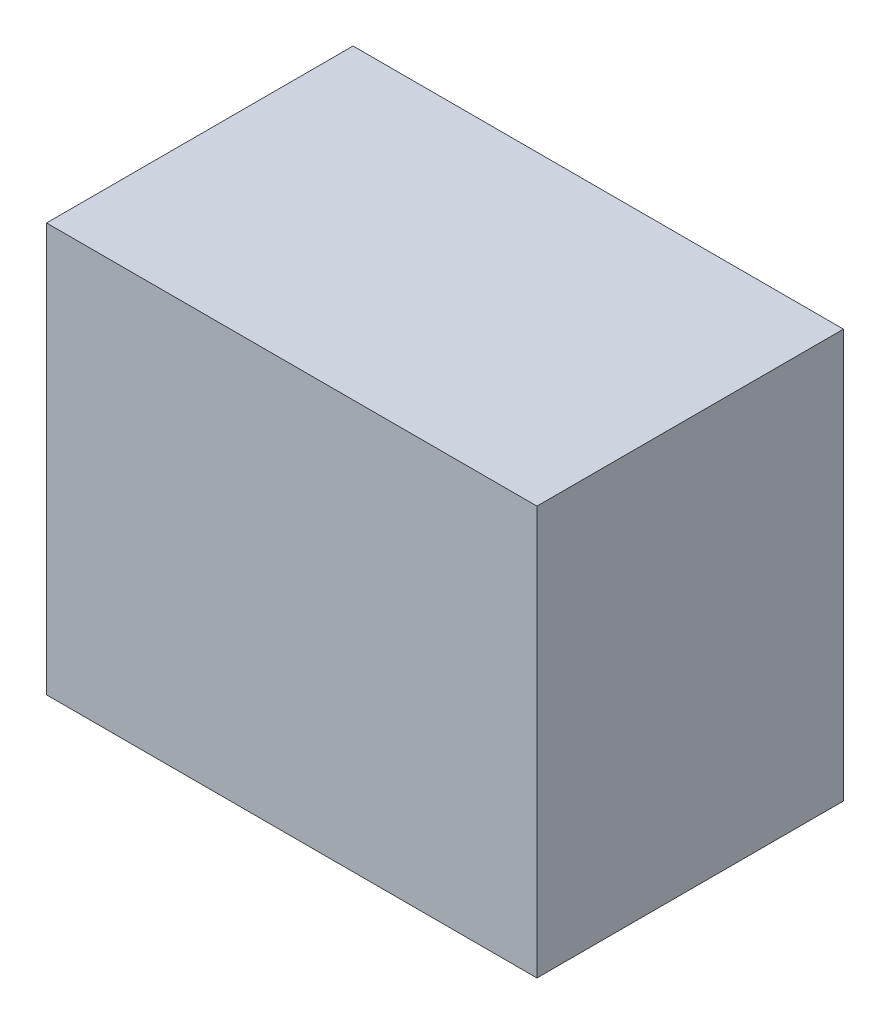
ISO-10303-21;
HEADER;
FILE_DESCRIPTION(('STEP AP214'),'2;1');
FILE_NAME('part.step','',(''),(''),'','','');
FILE_SCHEMA(('AUTOMOTIVE_DESIGN { 1 0 10303 214 1 1 1 1 }'));
ENDSEC;
DATA;
#1=APPLICATION_CONTEXT('core data for automotive mechanical design processes');
#2=APPLICATION_PROTOCOL_DEFINITION('international standard','automotive_design',2000,#1);
#3=PRODUCT_CONTEXT('',#1,'mechanical');
#4=PRODUCT('Part','Part','',(#3));
#5=PRODUCT_RELATED_PRODUCT_CATEGORY('part','',(#4));
#6=PRODUCT_DEFINITION_FORMATION('','',#4);
#7=PRODUCT_DEFINITION_CONTEXT('part definition',#1,'design');
#8=PRODUCT_DEFINITION('design','',#6,#7);
#9=PRODUCT_DEFINITION_SHAPE('','',#8);
#10=(LENGTH_UNIT() NAMED_UNIT(*) SI_UNIT(.MILLI.,.METRE.));
#11=(NAMED_UNIT(*) PLANE_ANGLE_UNIT() SI_UNIT($,.RADIAN.));
#12=(NAMED_UNIT(*) SI_UNIT($,.STERADIAN.) SOLID_ANGLE_UNIT());
#13=UNCERTAINTY_MEASURE_WITH_UNIT(LENGTH_MEASURE(1.E-05),#10,'distance_accuracy_value','');
#14=(GEOMETRIC_REPRESENTATION_CONTEXT(3) GLOBAL_UNCERTAINTY_ASSIGNED_CONTEXT((#13)) GLOBAL_UNIT_ASSIGNED_CONTEXT((#10,
#11,#12)) REPRESENTATION_CONTEXT('',''));
#15=CARTESIAN_POINT('',(0.,0.,0.));
#16=DIRECTION('',(0.,0.,1.));
#17=DIRECTION('',(1.,0.,0.));
#18=AXIS2_PLACEMENT_3D('',#15,#16,#17);
#19=CARTESIAN_POINT('',(60.,180.,-248.));
#20=DIRECTION('',(-1.,0.,0.));
#21=DIRECTION('',(0.,0.,1.));
#22=AXIS2_PLACEMENT_3D('',#19,#20,#21);
#23=PLANE('',#22);
#24=DIRECTION('',(0.,-1.,0.));
#25=VECTOR('',#24,1.);
#26=CARTESIAN_POINT('',(60.,180.,-173.));
#27=LINE('',#26,#25);
#28=CARTESIAN_POINT('',(60.,280.,-173.));
#29=VERTEX_POINT('',#28);
#30=CARTESIAN_POINT('',(60.,180.,-173.));
#31=VERTEX_POINT('',#30);
#32=EDGE_CURVE('E103',#29,#31,#27,.T.);
#33=ORIENTED_EDGE('',*,*,#32,.F.);
#34=DIRECTION('',(0.,0.,1.));
#35=VECTOR('',#34,1.);
#36=CARTESIAN_POINT('',(60.,280.,-248.));
#37=LINE('',#36,#35);
#38=CARTESIAN_POINT('',(60.,280.,-248.));
#39=VERTEX_POINT('',#38);
#40=EDGE_CURVE('E11',#39,#29,#37,.T.);
#41=ORIENTED_EDGE('',*,*,#40,.F.);
#42=DIRECTION('',(0.,-1.,0.));
#43=VECTOR('',#42,1.);
#44=CARTESIAN_POINT('',(60.,180.,-248.));
#45=LINE('',#44,#43);
#46=CARTESIAN_POINT('',(60.,180.,-248.));
#47=VERTEX_POINT('',#46);
#48=EDGE_CURVE('E97',#39,#47,#45,.T.);
#49=ORIENTED_EDGE('',*,*,#48,.T.);
#50=DIRECTION('',(0.,0.,1.));
#51=VECTOR('',#50,1.);
#52=CARTESIAN_POINT('',(60.,180.,-248.));
#53=LINE('',#52,#51);
#54=EDGE_CURVE('E42',#47,#31,#53,.T.);
#55=ORIENTED_EDGE('',*,*,#54,.T.);
#56=EDGE_LOOP('',(#33,#41,#49,#55));
#57=FACE_BOUND('',#56,.T.);
#58=ADVANCED_FACE('F39',(#57),#23,.T.);
#59=CARTESIAN_POINT('',(60.,280.,-248.));
#60=DIRECTION('',(0.,1.,0.));
#61=DIRECTION('',(0.,0.,1.));
#62=AXIS2_PLACEMENT_3D('',#59,#60,#61);
#63=PLANE('',#62);
#64=DIRECTION('',(-1.,0.,0.));
#65=VECTOR('',#64,1.);
#66=CARTESIAN_POINT('',(60.,280.,-173.));
#67=LINE('',#66,#65);
#68=CARTESIAN_POINT('',(180.,280.,-173.));
#69=VERTEX_POINT('',#68);
#70=EDGE_CURVE('E99',#69,#29,#67,.T.);
#71=ORIENTED_EDGE('',*,*,#70,.F.);
#72=DIRECTION('',(0.,0.,1.));
#73=VECTOR('',#72,1.);
#74=CARTESIAN_POINT('',(180.,280.,-248.));
#75=LINE('',#74,#73);
#76=CARTESIAN_POINT('',(180.,280.,-248.));
#77=VERTEX_POINT('',#76);
#78=EDGE_CURVE('E48',#77,#69,#75,.T.);
#79=ORIENTED_EDGE('',*,*,#78,.F.);
#80=DIRECTION('',(-1.,0.,0.));
#81=VECTOR('',#80,1.);
#82=CARTESIAN_POINT('',(60.,280.,-248.));
#83=LINE('',#82,#81);
#84=EDGE_CURVE('E94',#77,#39,#83,.T.);
#85=ORIENTED_EDGE('',*,*,#84,.T.);
#86=ORIENTED_EDGE('',*,*,#40,.T.);
#87=EDGE_LOOP('',(#71,#79,#85,#86));
#88=FACE_BOUND('',#87,.T.);
#89=ADVANCED_FACE('F113',(#88),#63,.T.);
#90=CARTESIAN_POINT('',(180.,180.,-248.));
#91=DIRECTION('',(1.,0.,0.));
#92=DIRECTION('',(0.,0.,-1.));
#93=AXIS2_PLACEMENT_3D('',#90,#91,#92);
#94=PLANE('',#93);
#95=DIRECTION('',(0.,1.,0.));
#96=VECTOR('',#95,1.);
#97=CARTESIAN_POINT('',(180.,180.,-173.));
#98=LINE('',#97,#96);
#99=CARTESIAN_POINT('',(180.,180.,-173.));
#100=VERTEX_POINT('',#99);
#101=EDGE_CURVE('E89',#100,#69,#98,.T.);
#102=ORIENTED_EDGE('',*,*,#101,.F.);
#103=DIRECTION('',(0.,0.,1.));
#104=VECTOR('',#103,1.);
#105=CARTESIAN_POINT('',(180.,180.,-248.));
#106=LINE('',#105,#104);
#107=CARTESIAN_POINT('',(180.,180.,-248.));
#108=VERTEX_POINT('',#107);
#109=EDGE_CURVE('E84',#108,#100,#106,.T.);
#110=ORIENTED_EDGE('',*,*,#109,.F.);
#111=DIRECTION('',(0.,1.,0.));
#112=VECTOR('',#111,1.);
#113=CARTESIAN_POINT('',(180.,180.,-248.));
#114=LINE('',#113,#112);
#115=EDGE_CURVE('E87',#108,#77,#114,.T.);
#116=ORIENTED_EDGE('',*,*,#115,.T.);
#117=ORIENTED_EDGE('',*,*,#78,.T.);
#118=EDGE_LOOP('',(#102,#110,#116,#117));
#119=FACE_BOUND('',#118,.T.);
#120=ADVANCED_FACE('F86',(#119),#94,.T.);
#121=CARTESIAN_POINT('',(60.,180.,-248.));
#122=DIRECTION('',(0.,-1.,0.));
#123=DIRECTION('',(0.,0.,-1.));
#124=AXIS2_PLACEMENT_3D('',#121,#122,#123);
#125=PLANE('',#124);
#126=DIRECTION('',(1.,0.,0.));
#127=VECTOR('',#126,1.);
#128=CARTESIAN_POINT('',(60.,180.,-173.));
#129=LINE('',#128,#127);
#130=EDGE_CURVE('E106',#31,#100,#129,.T.);
#131=ORIENTED_EDGE('',*,*,#130,.F.);
#132=ORIENTED_EDGE('',*,*,#54,.F.);
#133=DIRECTION('',(1.,0.,0.));
#134=VECTOR('',#133,1.);
#135=CARTESIAN_POINT('',(60.,180.,-248.));
#136=LINE('',#135,#134);
#137=EDGE_CURVE('E93',#47,#108,#136,.T.);
#138=ORIENTED_EDGE('',*,*,#137,.T.);
#139=ORIENTED_EDGE('',*,*,#109,.T.);
#140=EDGE_LOOP('',(#131,#132,#138,#139));
#141=FACE_BOUND('',#140,.T.);
#142=ADVANCED_FACE('F96',(#141),#125,.T.);
#143=CARTESIAN_POINT('',(0.,0.,-248.));
#144=DIRECTION('',(0.,0.,-1.));
#145=DIRECTION('',(-1.,0.,0.));
#146=AXIS2_PLACEMENT_3D('',#143,#144,#145);
#147=PLANE('',#146);
#148=ORIENTED_EDGE('',*,*,#48,.F.);
#149=ORIENTED_EDGE('',*,*,#84,.F.);
#150=ORIENTED_EDGE('',*,*,#115,.F.);
#151=ORIENTED_EDGE('',*,*,#137,.F.);
#152=EDGE_LOOP('',(#148,#149,#150,#151));
#153=FACE_BOUND('',#152,.T.);
#154=ADVANCED_FACE('F92',(#153),#147,.T.);
#155=CARTESIAN_POINT('',(0.,0.,-173.));
#156=DIRECTION('',(0.,0.,-1.));
#157=DIRECTION('',(-1.,0.,0.));
#158=AXIS2_PLACEMENT_3D('',#155,#156,#157);
#159=PLANE('',#158);
#160=ORIENTED_EDGE('',*,*,#32,.T.);
#161=ORIENTED_EDGE('',*,*,#130,.T.);
#162=ORIENTED_EDGE('',*,*,#101,.T.);
#163=ORIENTED_EDGE('',*,*,#70,.T.);
#164=EDGE_LOOP('',(#160,#161,#162,#163));
#165=FACE_BOUND('',#164,.T.);
#166=ADVANCED_FACE('F112',(#165),#159,.F.);
#167=CLOSED_SHELL('',(#58,#89,#120,#142,#154,#166));
#168=MANIFOLD_SOLID_BREP('B2',#167);
#169=ADVANCED_BREP_SHAPE_REPRESENTATION('',(#18,#168),#14);
#170=SHAPE_DEFINITION_REPRESENTATION(#9,#169);
ENDSEC;
END-ISO-10303-21;
